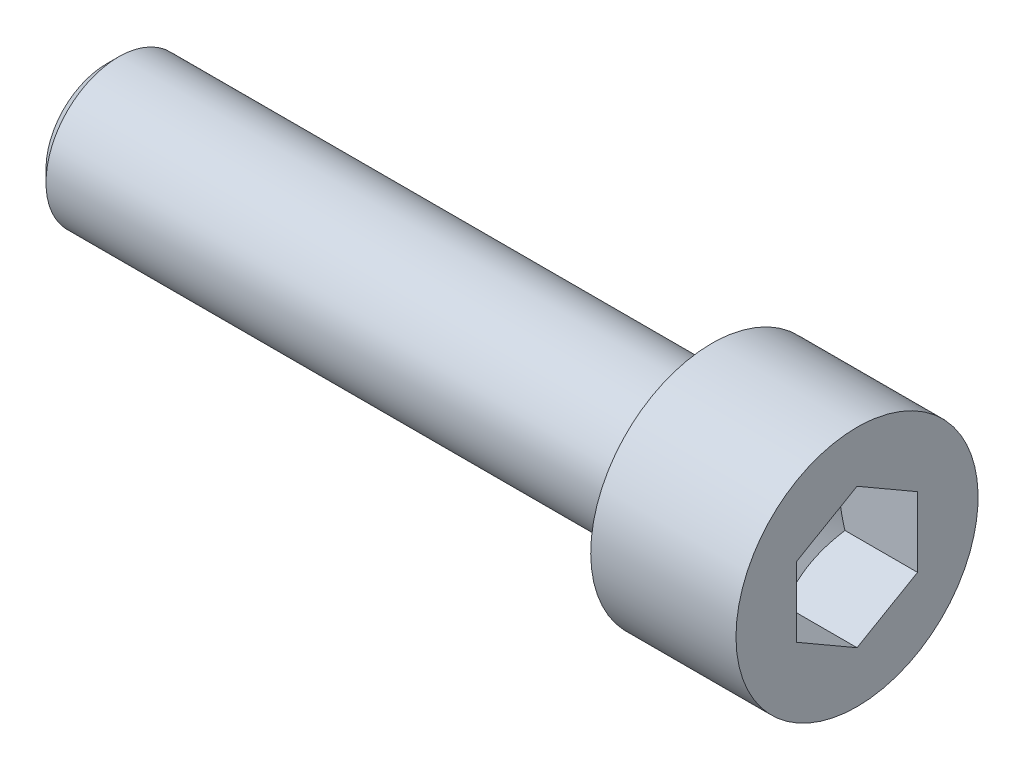
ISO-10303-21;
HEADER;
FILE_DESCRIPTION(('STEP AP214'),'2;1');
FILE_NAME('part.step','',(''),(''),'','','');
FILE_SCHEMA(('AUTOMOTIVE_DESIGN { 1 0 10303 214 1 1 1 1 }'));
ENDSEC;
DATA;
#1=APPLICATION_CONTEXT('core data for automotive mechanical design processes');
#2=APPLICATION_PROTOCOL_DEFINITION('international standard','automotive_design',2000,#1);
#3=PRODUCT_CONTEXT('',#1,'mechanical');
#4=PRODUCT('Part','Part','',(#3));
#5=PRODUCT_RELATED_PRODUCT_CATEGORY('part','',(#4));
#6=PRODUCT_DEFINITION_FORMATION('','',#4);
#7=PRODUCT_DEFINITION_CONTEXT('part definition',#1,'design');
#8=PRODUCT_DEFINITION('design','',#6,#7);
#9=PRODUCT_DEFINITION_SHAPE('','',#8);
#10=(LENGTH_UNIT() NAMED_UNIT(*) SI_UNIT(.MILLI.,.METRE.));
#11=(NAMED_UNIT(*) PLANE_ANGLE_UNIT() SI_UNIT($,.RADIAN.));
#12=(NAMED_UNIT(*) SI_UNIT($,.STERADIAN.) SOLID_ANGLE_UNIT());
#13=UNCERTAINTY_MEASURE_WITH_UNIT(LENGTH_MEASURE(1.E-05),#10,'distance_accuracy_value','');
#14=(GEOMETRIC_REPRESENTATION_CONTEXT(3) GLOBAL_UNCERTAINTY_ASSIGNED_CONTEXT((#13)) GLOBAL_UNIT_ASSIGNED_CONTEXT((#10,
#11,#12)) REPRESENTATION_CONTEXT('',''));
#15=CARTESIAN_POINT('',(0.,0.,0.));
#16=DIRECTION('',(0.,0.,1.));
#17=DIRECTION('',(1.,0.,0.));
#18=AXIS2_PLACEMENT_3D('',#15,#16,#17);
#19=CARTESIAN_POINT('',(0.099999999999972,-5.5,-5.5));
#20=CARTESIAN_POINT('',(0.099999999999972,-5.5,5.5));
#21=CARTESIAN_POINT('',(0.099999999999972,5.5,-5.5));
#22=CARTESIAN_POINT('',(0.099999999999972,5.5,5.5));
#23=(BOUNDED_SURFACE() B_SPLINE_SURFACE(1,1,((#19,#20),(#21,#22)),.UNSPECIFIED.,.F.,.F.,
.F.) B_SPLINE_SURFACE_WITH_KNOTS((2,2),(2,2),(0.,1.),(0.,1.),
.UNSPECIFIED.) GEOMETRIC_REPRESENTATION_ITEM() RATIONAL_B_SPLINE_SURFACE(((1.,1.),(1.,1.))) REPRESENTATION_ITEM('') SURFACE());
#24=CARTESIAN_POINT('',(0.099999999999975,2.88675134594817,0.));
#25=CARTESIAN_POINT('',(0.099999999999975,1.44337567297408,-2.49999999999994));
#26=(BOUNDED_CURVE() B_SPLINE_CURVE(1,(#24,#25),.UNSPECIFIED.,.F.,
.F.) B_SPLINE_CURVE_WITH_KNOTS((2,2),(0.,1.),
.UNSPECIFIED.) CURVE() GEOMETRIC_REPRESENTATION_ITEM() RATIONAL_B_SPLINE_CURVE((1.,1.)) REPRESENTATION_ITEM(''));
#27=CARTESIAN_POINT('',(0.099999999999975,2.88675134594813,1.014813E-13));
#28=VERTEX_POINT('',#27);
#29=CARTESIAN_POINT('',(0.099999999999975,1.44337567297402,-2.49999999999991));
#30=VERTEX_POINT('',#29);
#31=EDGE_CURVE('P0_E202',#28,#30,#26,.T.);
#32=CARTESIAN_POINT('',(0.099999999999975,1.44337567297408,-2.49999999999994));
#33=CARTESIAN_POINT('',(0.099999999999975,-1.44337567297403,-2.49999999999992));
#34=(BOUNDED_CURVE() B_SPLINE_CURVE(1,(#32,#33),.UNSPECIFIED.,.F.,
.F.) B_SPLINE_CURVE_WITH_KNOTS((2,2),(0.,1.),
.UNSPECIFIED.) CURVE() GEOMETRIC_REPRESENTATION_ITEM() RATIONAL_B_SPLINE_CURVE((1.,1.)) REPRESENTATION_ITEM(''));
#35=CARTESIAN_POINT('',(0.099999999999975,-1.44337567297409,-2.49999999999988));
#36=VERTEX_POINT('',#35);
#37=EDGE_CURVE('P0_E116',#30,#36,#34,.T.);
#38=CARTESIAN_POINT('',(0.099999999999975,-1.44337567297403,-2.49999999999992));
#39=CARTESIAN_POINT('',(0.099999999999975,-2.88675134594808,1.246434E-13));
#40=(BOUNDED_CURVE() B_SPLINE_CURVE(1,(#38,#39),.UNSPECIFIED.,.F.,
.F.) B_SPLINE_CURVE_WITH_KNOTS((2,2),(0.,1.),
.UNSPECIFIED.) CURVE() GEOMETRIC_REPRESENTATION_ITEM() RATIONAL_B_SPLINE_CURVE((1.,1.)) REPRESENTATION_ITEM(''));
#41=CARTESIAN_POINT('',(0.099999999999975,-2.88675134594812,1.786765E-13));
#42=VERTEX_POINT('',#41);
#43=EDGE_CURVE('P0_E211',#36,#42,#40,.T.);
#44=CARTESIAN_POINT('',(0.099999999999975,-2.88675134594808,1.246434E-13));
#45=CARTESIAN_POINT('',(0.099999999999975,-1.443375672974,2.50000000000012));
#46=(BOUNDED_CURVE() B_SPLINE_CURVE(1,(#44,#45),.UNSPECIFIED.,.F.,
.F.) B_SPLINE_CURVE_WITH_KNOTS((2,2),(0.,1.),
.UNSPECIFIED.) CURVE() GEOMETRIC_REPRESENTATION_ITEM() RATIONAL_B_SPLINE_CURVE((1.,1.)) REPRESENTATION_ITEM(''));
#47=CARTESIAN_POINT('',(0.099999999999975,-1.44337567297402,2.50000000000016));
#48=VERTEX_POINT('',#47);
#49=EDGE_CURVE('P0_E159',#42,#48,#46,.T.);
#50=CARTESIAN_POINT('',(0.099999999999975,-1.443375672974,2.50000000000012));
#51=CARTESIAN_POINT('',(0.099999999999975,1.44337567297418,2.5));
#52=(BOUNDED_CURVE() B_SPLINE_CURVE(1,(#50,#51),.UNSPECIFIED.,.F.,
.F.) B_SPLINE_CURVE_WITH_KNOTS((2,2),(0.,1.),
.UNSPECIFIED.) CURVE() GEOMETRIC_REPRESENTATION_ITEM() RATIONAL_B_SPLINE_CURVE((1.,1.)) REPRESENTATION_ITEM(''));
#53=CARTESIAN_POINT('',(0.099999999999975,1.44337567297415,2.50000000000005));
#54=VERTEX_POINT('',#53);
#55=EDGE_CURVE('P0_E157',#48,#54,#52,.T.);
#56=CARTESIAN_POINT('',(0.099999999999975,1.44337567297418,2.5));
#57=CARTESIAN_POINT('',(0.099999999999975,2.88675134594817,0.));
#58=(BOUNDED_CURVE() B_SPLINE_CURVE(1,(#56,#57),.UNSPECIFIED.,.F.,
.F.) B_SPLINE_CURVE_WITH_KNOTS((2,2),(0.,1.),
.UNSPECIFIED.) CURVE() GEOMETRIC_REPRESENTATION_ITEM() RATIONAL_B_SPLINE_CURVE((1.,1.)) REPRESENTATION_ITEM(''));
#59=EDGE_CURVE('P0_E145',#54,#28,#58,.T.);
#60=CARTESIAN_POINT('',(0.099999999999972,5.,0.));
#61=CARTESIAN_POINT('',(0.099999999999972,5.,8.66025403784438));
#62=CARTESIAN_POINT('',(0.099999999999972,-2.5,4.33012701892219));
#63=CARTESIAN_POINT('',(0.099999999999972,-10.,0.));
#64=CARTESIAN_POINT('',(0.099999999999972,-2.5,-4.33012701892219));
#65=CARTESIAN_POINT('',(0.099999999999972,5.,-8.66025403784438));
#66=CARTESIAN_POINT('',(0.099999999999972,5.,0.));
#67=(BOUNDED_CURVE() B_SPLINE_CURVE(2,(#60,#61,#62,#63,#64,#65,#66),.UNSPECIFIED.,.T.,
.F.) B_SPLINE_CURVE_WITH_KNOTS((3,2,2,3),(0.,0.333333333333333,0.666666666666667,1.),
.UNSPECIFIED.) CURVE() GEOMETRIC_REPRESENTATION_ITEM() RATIONAL_B_SPLINE_CURVE((1.,0.5,1.,0.5,
1.,0.5,1.)) REPRESENTATION_ITEM(''));
#68=CARTESIAN_POINT('',(0.099999999999972,5.,0.));
#69=VERTEX_POINT('',#68);
#70=EDGE_CURVE('P0_E11',#69,#69,#67,.T.);
#71=ORIENTED_EDGE('',*,*,#31,.T.);
#72=ORIENTED_EDGE('',*,*,#37,.T.);
#73=ORIENTED_EDGE('',*,*,#43,.T.);
#74=ORIENTED_EDGE('',*,*,#49,.T.);
#75=ORIENTED_EDGE('',*,*,#55,.T.);
#76=ORIENTED_EDGE('',*,*,#59,.T.);
#77=EDGE_LOOP('',(#71,#72,#73,#74,#75,#76));
#78=FACE_BOUND('',#77,.T.);
#79=ORIENTED_EDGE('',*,*,#70,.T.);
#80=EDGE_LOOP('',(#79));
#81=FACE_BOUND('',#80,.T.);
#82=ADVANCED_FACE('P0_F17',(#78,#81),#23,.T.);
#83=CARTESIAN_POINT('',(-5.9,5.,0.));
#84=CARTESIAN_POINT('',(0.099999999999972,5.,0.));
#85=CARTESIAN_POINT('',(-5.9,5.,8.66025403784438));
#86=CARTESIAN_POINT('',(0.099999999999972,5.,8.66025403784438));
#87=CARTESIAN_POINT('',(-5.9,-2.5,4.3301270189222));
#88=CARTESIAN_POINT('',(0.099999999999972,-2.5,4.33012701892219));
#89=CARTESIAN_POINT('',(-5.9,-10.,0.));
#90=CARTESIAN_POINT('',(0.099999999999972,-10.,0.));
#91=CARTESIAN_POINT('',(-5.9,-2.5,-4.33012701892219));
#92=CARTESIAN_POINT('',(0.099999999999972,-2.5,-4.33012701892219));
#93=CARTESIAN_POINT('',(-5.9,5.,-8.66025403784438));
#94=CARTESIAN_POINT('',(0.099999999999972,5.,-8.66025403784438));
#95=CARTESIAN_POINT('',(-5.9,5.,0.));
#96=CARTESIAN_POINT('',(0.099999999999972,5.,0.));
#97=(BOUNDED_SURFACE() B_SPLINE_SURFACE(2,1,((#83,#84),(#85,#86),(#87,#88),(#89,#90),(#91,#92),
(#93,#94),(#95,#96)),.UNSPECIFIED.,.T.,.F.,.F.) B_SPLINE_SURFACE_WITH_KNOTS((3,2,2,3),(2,2),(0.,
0.333333333333333,0.666666666666667,1.),(0.,1.),
.UNSPECIFIED.) GEOMETRIC_REPRESENTATION_ITEM() RATIONAL_B_SPLINE_SURFACE(((1.,1.),(0.5,0.5),(1.,
1.),(0.5,0.5),(1.,1.),(0.5,0.5),(1.,1.))) REPRESENTATION_ITEM('') SURFACE());
#98=CARTESIAN_POINT('',(-5.9,5.,0.));
#99=CARTESIAN_POINT('',(-5.9,5.,8.66025403784438));
#100=CARTESIAN_POINT('',(-5.9,-2.5,4.3301270189222));
#101=CARTESIAN_POINT('',(-5.9,-10.,0.));
#102=CARTESIAN_POINT('',(-5.9,-2.5,-4.33012701892219));
#103=CARTESIAN_POINT('',(-5.9,5.,-8.66025403784438));
#104=CARTESIAN_POINT('',(-5.9,5.,0.));
#105=(BOUNDED_CURVE() B_SPLINE_CURVE(2,(#98,#99,#100,#101,#102,#103,#104),.UNSPECIFIED.,.T.,
.F.) B_SPLINE_CURVE_WITH_KNOTS((3,2,2,3),(0.,0.333333333333333,0.666666666666667,1.),
.UNSPECIFIED.) CURVE() GEOMETRIC_REPRESENTATION_ITEM() RATIONAL_B_SPLINE_CURVE((1.,0.5,1.,0.5,
1.,0.5,1.)) REPRESENTATION_ITEM(''));
#106=CARTESIAN_POINT('',(-5.9,5.,0.));
#107=VERTEX_POINT('',#106);
#108=EDGE_CURVE('P0_E22',#107,#107,#105,.T.);
#109=CARTESIAN_POINT('',(0.099999999999972,5.,0.));
#110=CARTESIAN_POINT('',(-5.9,5.,0.));
#111=(BOUNDED_CURVE() B_SPLINE_CURVE(1,(#109,#110),.UNSPECIFIED.,.F.,
.F.) B_SPLINE_CURVE_WITH_KNOTS((2,2),(0.,1.),
.UNSPECIFIED.) CURVE() GEOMETRIC_REPRESENTATION_ITEM() RATIONAL_B_SPLINE_CURVE((1.,1.)) REPRESENTATION_ITEM(''));
#112=EDGE_CURVE('P0_E30',#69,#107,#111,.T.);
#113=ORIENTED_EDGE('',*,*,#108,.T.);
#114=ORIENTED_EDGE('',*,*,#112,.F.);
#115=ORIENTED_EDGE('',*,*,#70,.F.);
#116=ORIENTED_EDGE('',*,*,#112,.T.);
#117=EDGE_LOOP('',(#113,#114,#115,#116));
#118=FACE_BOUND('',#117,.T.);
#119=ADVANCED_FACE('P0_F445',(#118),#97,.T.);
#120=CARTESIAN_POINT('',(-5.9,-5.5,5.5));
#121=CARTESIAN_POINT('',(-5.9,-5.5,-5.5));
#122=CARTESIAN_POINT('',(-5.9,5.5,5.5));
#123=CARTESIAN_POINT('',(-5.9,5.5,-5.5));
#124=(BOUNDED_SURFACE() B_SPLINE_SURFACE(1,1,((#120,#121),(#122,#123)),.UNSPECIFIED.,.F.,.F.,
.F.) B_SPLINE_SURFACE_WITH_KNOTS((2,2),(2,2),(0.,1.),(0.,1.),
.UNSPECIFIED.) GEOMETRIC_REPRESENTATION_ITEM() RATIONAL_B_SPLINE_SURFACE(((1.,1.),(1.,1.))) REPRESENTATION_ITEM('') SURFACE());
#125=CARTESIAN_POINT('',(-5.9,3.00000000001427,0.));
#126=CARTESIAN_POINT('',(-5.9,3.00000000001426,5.19615242273134));
#127=CARTESIAN_POINT('',(-5.9,-1.50000000000713,2.59807621136567));
#128=CARTESIAN_POINT('',(-5.9,-6.00000000002853,0.));
#129=CARTESIAN_POINT('',(-5.9,-1.50000000000713,-2.59807621136567));
#130=CARTESIAN_POINT('',(-5.9,3.00000000001426,-5.19615242273134));
#131=CARTESIAN_POINT('',(-5.9,3.00000000001427,0.));
#132=(BOUNDED_CURVE() B_SPLINE_CURVE(2,(#125,#126,#127,#128,#129,#130,#131),.UNSPECIFIED.,.T.,
.F.) B_SPLINE_CURVE_WITH_KNOTS((3,2,2,3),(0.,0.333333333333333,0.666666666666667,1.),
.UNSPECIFIED.) CURVE() GEOMETRIC_REPRESENTATION_ITEM() RATIONAL_B_SPLINE_CURVE((1.,0.5,1.,0.5,
1.,0.5,1.)) REPRESENTATION_ITEM(''));
#133=CARTESIAN_POINT('',(-5.9,3.00000000001427,0.));
#134=VERTEX_POINT('',#133);
#135=EDGE_CURVE('P0_E248',#134,#134,#132,.T.);
#136=ORIENTED_EDGE('',*,*,#135,.T.);
#137=EDGE_LOOP('',(#136));
#138=FACE_BOUND('',#137,.T.);
#139=ORIENTED_EDGE('',*,*,#108,.F.);
#140=EDGE_LOOP('',(#139));
#141=FACE_BOUND('',#140,.T.);
#142=ADVANCED_FACE('P0_F362',(#138,#141),#124,.T.);
#143=CARTESIAN_POINT('',(-6.9,3.00000000001428,0.));
#144=CARTESIAN_POINT('',(-5.9,3.00000000001427,0.));
#145=CARTESIAN_POINT('',(-6.9,3.00000000001428,5.19615242273136));
#146=CARTESIAN_POINT('',(-5.9,3.00000000001427,5.19615242273134));
#147=CARTESIAN_POINT('',(-6.9,-1.50000000000714,2.59807621136568));
#148=CARTESIAN_POINT('',(-5.9,-1.50000000000713,2.59807621136567));
#149=CARTESIAN_POINT('',(-6.9,-6.00000000002856,0.));
#150=CARTESIAN_POINT('',(-5.9,-6.00000000002853,0.));
#151=CARTESIAN_POINT('',(-6.9,-1.50000000000714,-2.59807621136568));
#152=CARTESIAN_POINT('',(-5.9,-1.50000000000713,-2.59807621136567));
#153=CARTESIAN_POINT('',(-6.9,3.00000000001427,-5.19615242273136));
#154=CARTESIAN_POINT('',(-5.9,3.00000000001426,-5.19615242273134));
#155=CARTESIAN_POINT('',(-6.9,3.00000000001428,0.));
#156=CARTESIAN_POINT('',(-5.9,3.00000000001427,0.));
#157=(BOUNDED_SURFACE() B_SPLINE_SURFACE(2,1,((#143,#144),(#145,#146),(#147,#148),(#149,#150),
(#151,#152),(#153,#154),(#155,#156)),.UNSPECIFIED.,.T.,.F.,.F.) B_SPLINE_SURFACE_WITH_KNOTS((3,
2,2,3),(2,2),(0.,0.333333333333333,0.666666666666667,1.),(0.,1.),
.UNSPECIFIED.) GEOMETRIC_REPRESENTATION_ITEM() RATIONAL_B_SPLINE_SURFACE(((1.,1.),(0.5,0.5),(1.,
1.),(0.5,0.5),(1.,1.),(0.5,0.5),(1.,1.))) REPRESENTATION_ITEM('') SURFACE());
#158=CARTESIAN_POINT('',(-6.9,3.00000000001428,0.));
#159=CARTESIAN_POINT('',(-6.9,3.00000000001428,5.19615242273136));
#160=CARTESIAN_POINT('',(-6.9,-1.50000000000714,2.59807621136568));
#161=CARTESIAN_POINT('',(-6.9,-6.00000000002856,0.));
#162=CARTESIAN_POINT('',(-6.9,-1.50000000000714,-2.59807621136568));
#163=CARTESIAN_POINT('',(-6.9,3.00000000001427,-5.19615242273136));
#164=CARTESIAN_POINT('',(-6.9,3.00000000001428,0.));
#165=(BOUNDED_CURVE() B_SPLINE_CURVE(2,(#158,#159,#160,#161,#162,#163,#164),.UNSPECIFIED.,.T.,
.F.) B_SPLINE_CURVE_WITH_KNOTS((3,2,2,3),(0.,0.333333333333333,0.666666666666667,1.),
.UNSPECIFIED.) CURVE() GEOMETRIC_REPRESENTATION_ITEM() RATIONAL_B_SPLINE_CURVE((1.,0.5,1.,0.5,
1.,0.5,1.)) REPRESENTATION_ITEM(''));
#166=CARTESIAN_POINT('',(-6.9,3.00000000001428,0.));
#167=VERTEX_POINT('',#166);
#168=EDGE_CURVE('P0_E154',#167,#167,#165,.T.);
#169=CARTESIAN_POINT('',(-5.9,3.00000000001427,0.));
#170=CARTESIAN_POINT('',(-6.9,3.00000000001428,0.));
#171=(BOUNDED_CURVE() B_SPLINE_CURVE(1,(#169,#170),.UNSPECIFIED.,.F.,
.F.) B_SPLINE_CURVE_WITH_KNOTS((2,2),(0.,1.),
.UNSPECIFIED.) CURVE() GEOMETRIC_REPRESENTATION_ITEM() RATIONAL_B_SPLINE_CURVE((1.,1.)) REPRESENTATION_ITEM(''));
#172=EDGE_CURVE('P0_E90',#134,#167,#171,.T.);
#173=ORIENTED_EDGE('',*,*,#168,.T.);
#174=ORIENTED_EDGE('',*,*,#172,.F.);
#175=ORIENTED_EDGE('',*,*,#135,.F.);
#176=ORIENTED_EDGE('',*,*,#172,.T.);
#177=EDGE_LOOP('',(#173,#174,#175,#176));
#178=FACE_BOUND('',#177,.T.);
#179=ADVANCED_FACE('P0_F356',(#178),#157,.T.);
#180=CARTESIAN_POINT('',(-6.9,-3.30000000001571,3.30000000001571));
#181=CARTESIAN_POINT('',(-6.9,-3.30000000001571,-3.30000000001571));
#182=CARTESIAN_POINT('',(-6.9,3.30000000001571,3.30000000001571));
#183=CARTESIAN_POINT('',(-6.9,3.30000000001571,-3.30000000001571));
#184=(BOUNDED_SURFACE() B_SPLINE_SURFACE(1,1,((#180,#181),(#182,#183)),.UNSPECIFIED.,.F.,.F.,
.F.) B_SPLINE_SURFACE_WITH_KNOTS((2,2),(2,2),(0.,1.),(0.,1.),
.UNSPECIFIED.) GEOMETRIC_REPRESENTATION_ITEM() RATIONAL_B_SPLINE_SURFACE(((1.,1.),(1.,1.))) REPRESENTATION_ITEM('') SURFACE());
#185=ORIENTED_EDGE('',*,*,#168,.F.);
#186=EDGE_LOOP('',(#185));
#187=FACE_BOUND('',#186,.T.);
#188=ADVANCED_FACE('P0_F361',(#187),#184,.T.);
#189=CARTESIAN_POINT('',(0.099999999999972,1.44337567297415,2.50000000000005));
#190=CARTESIAN_POINT('',(-4.13452505549687,1.44337567297415,2.50000000000005));
#191=CARTESIAN_POINT('',(0.099999999999972,2.88675134594813,1.014813E-13));
#192=CARTESIAN_POINT('',(-4.13452505549687,2.88675134594813,1.014813E-13));
#193=(BOUNDED_SURFACE() B_SPLINE_SURFACE(1,1,((#189,#190),(#191,#192)),.UNSPECIFIED.,.F.,.F.,
.F.) B_SPLINE_SURFACE_WITH_KNOTS((2,2),(2,2),(0.,1.),(0.,0.891381592873045),
.UNSPECIFIED.) GEOMETRIC_REPRESENTATION_ITEM() RATIONAL_B_SPLINE_SURFACE(((1.,1.),(1.,1.))) REPRESENTATION_ITEM('') SURFACE());
#194=CARTESIAN_POINT('',(0.099999999999975,2.88675134594817,0.));
#195=CARTESIAN_POINT('',(-2.9,2.88675134594817,0.));
#196=(BOUNDED_CURVE() B_SPLINE_CURVE(1,(#194,#195),.UNSPECIFIED.,.F.,
.F.) B_SPLINE_CURVE_WITH_KNOTS((2,2),(0.,0.631509967132636),
.UNSPECIFIED.) CURVE() GEOMETRIC_REPRESENTATION_ITEM() RATIONAL_B_SPLINE_CURVE((1.,1.)) REPRESENTATION_ITEM(''));
#197=CARTESIAN_POINT('',(-2.9,2.88675134594817,0.));
#198=VERTEX_POINT('',#197);
#199=EDGE_CURVE('P0_E151',#28,#198,#196,.T.);
#200=CARTESIAN_POINT('',(-2.9,1.44337567297418,2.5));
#201=CARTESIAN_POINT('',(0.099999999999975,1.44337567297418,2.5));
#202=(BOUNDED_CURVE() B_SPLINE_CURVE(1,(#200,#201),.UNSPECIFIED.,.F.,
.F.) B_SPLINE_CURVE_WITH_KNOTS((2,2),(0.368490032867366,1.),
.UNSPECIFIED.) CURVE() GEOMETRIC_REPRESENTATION_ITEM() RATIONAL_B_SPLINE_CURVE((1.,1.)) REPRESENTATION_ITEM(''));
#203=CARTESIAN_POINT('',(-2.9,1.44337567297415,2.50000000000005));
#204=VERTEX_POINT('',#203);
#205=EDGE_CURVE('P0_E149',#204,#54,#202,.T.);
#206=CARTESIAN_POINT('',(-2.9,2.88675134594822,0.));
#207=CARTESIAN_POINT('',(-3.3376297113811,2.16506350946119,1.25000000000003));
#208=CARTESIAN_POINT('',(-2.90000000000003,1.44337567297416,2.50000000000005));
#209=(BOUNDED_CURVE() B_SPLINE_CURVE(2,(#206,#207,#208),.UNSPECIFIED.,.F.,
.F.) B_SPLINE_CURVE_WITH_KNOTS((3,3),(0.,1.),
.UNSPECIFIED.) CURVE() GEOMETRIC_REPRESENTATION_ITEM() RATIONAL_B_SPLINE_CURVE((1.,
1.15470053837925,1.)) REPRESENTATION_ITEM(''));
#210=EDGE_CURVE('P0_E137',#198,#204,#209,.T.);
#211=ORIENTED_EDGE('',*,*,#199,.F.);
#212=ORIENTED_EDGE('',*,*,#59,.F.);
#213=ORIENTED_EDGE('',*,*,#205,.F.);
#214=ORIENTED_EDGE('',*,*,#210,.F.);
#215=EDGE_LOOP('',(#211,#212,#213,#214));
#216=FACE_BOUND('',#215,.T.);
#217=ADVANCED_FACE('P0_F147',(#216),#193,.F.);
#218=CARTESIAN_POINT('',(-4.65051884552429,0.,0.));
#219=CARTESIAN_POINT('',(-2.9,2.88675134594821,0.));
#220=CARTESIAN_POINT('',(-4.65051884552429,0.,0.));
#221=CARTESIAN_POINT('',(-2.90000000000003,2.88675134594824,-5.));
#222=CARTESIAN_POINT('',(-4.65051884552429,0.,0.));
#223=CARTESIAN_POINT('',(-2.9,-1.44337567297402,-2.5));
#224=CARTESIAN_POINT('',(-4.65051884552429,0.,0.));
#225=CARTESIAN_POINT('',(-2.90000000000004,-5.77350269189628,0.));
#226=CARTESIAN_POINT('',(-4.65051884552429,0.,0.));
#227=CARTESIAN_POINT('',(-2.9,-1.44337567297405,2.50000000000005));
#228=CARTESIAN_POINT('',(-4.65051884552429,0.,0.));
#229=CARTESIAN_POINT('',(-2.90000000000003,2.88675134594818,5.00000000000011));
#230=CARTESIAN_POINT('',(-4.65051884552429,0.,0.));
#231=CARTESIAN_POINT('',(-2.9,2.88675134594821,0.));
#232=(BOUNDED_SURFACE() B_SPLINE_SURFACE(2,1,((#218,#219),(#220,#221),(#222,#223),(#224,#225),
(#226,#227),(#228,#229),(#230,#231)),.UNSPECIFIED.,.T.,.F.,.F.) B_SPLINE_SURFACE_WITH_KNOTS((3,
2,2,3),(2,2),(0.,0.333333333333333,0.666666666666667,1.),(0.,1.),
.UNSPECIFIED.) GEOMETRIC_REPRESENTATION_ITEM() RATIONAL_B_SPLINE_SURFACE(((1.,1.),(0.5,0.5),(1.,
1.),(0.5,0.5),(1.,1.),(0.5,0.5),(1.,1.))) REPRESENTATION_ITEM('') SURFACE());
#233=CARTESIAN_POINT('',(-2.9,2.88675134594821,0.));
#234=CARTESIAN_POINT('',(-4.6505188455243,0.,0.));
#235=(BOUNDED_CURVE() B_SPLINE_CURVE(1,(#233,#234),.UNSPECIFIED.,.F.,
.F.) B_SPLINE_CURVE_WITH_KNOTS((2,2),(0.,1.),
.UNSPECIFIED.) CURVE() GEOMETRIC_REPRESENTATION_ITEM() RATIONAL_B_SPLINE_CURVE((1.,1.)) REPRESENTATION_ITEM(''));
#236=CARTESIAN_POINT('',(-4.6505188455243,0.,0.));
#237=VERTEX_POINT('',#236);
#238=EDGE_CURVE('P0_E78',#198,#237,#235,.T.);
#239=CARTESIAN_POINT('',(-2.90000000000003,1.44337567297422,2.5));
#240=CARTESIAN_POINT('',(-3.33762971138109,1.285997E-13,2.50000000000007));
#241=CARTESIAN_POINT('',(-2.90000000000004,-1.44337567297396,2.50000000000012));
#242=(BOUNDED_CURVE() B_SPLINE_CURVE(2,(#239,#240,#241),.UNSPECIFIED.,.F.,
.F.) B_SPLINE_CURVE_WITH_KNOTS((3,3),(0.,1.),
.UNSPECIFIED.) CURVE() GEOMETRIC_REPRESENTATION_ITEM() RATIONAL_B_SPLINE_CURVE((1.,
1.15470053837925,1.)) REPRESENTATION_ITEM(''));
#243=CARTESIAN_POINT('',(-2.9,-1.44337567297402,2.50000000000016));
#244=VERTEX_POINT('',#243);
#245=EDGE_CURVE('P0_E167',#204,#244,#242,.T.);
#246=CARTESIAN_POINT('',(-2.90000000000004,-1.44337567297402,2.50000000000008));
#247=CARTESIAN_POINT('',(-3.33762971138111,-2.16506350946107,1.25000000000006));
#248=CARTESIAN_POINT('',(-2.90000000000004,-2.88675134594812,0.));
#249=(BOUNDED_CURVE() B_SPLINE_CURVE(2,(#246,#247,#248),.UNSPECIFIED.,.F.,
.F.) B_SPLINE_CURVE_WITH_KNOTS((3,3),(0.,1.),
.UNSPECIFIED.) CURVE() GEOMETRIC_REPRESENTATION_ITEM() RATIONAL_B_SPLINE_CURVE((1.,
1.15470053837925,1.)) REPRESENTATION_ITEM(''));
#250=CARTESIAN_POINT('',(-2.9,-2.88675134594812,1.786765E-13));
#251=VERTEX_POINT('',#250);
#252=EDGE_CURVE('P0_E219',#244,#251,#249,.T.);
#253=CARTESIAN_POINT('',(-2.90000000000005,-2.88675134594813,2.061754E-13));
#254=CARTESIAN_POINT('',(-3.33762971138118,-2.16506350946104,-1.24999999999993));
#255=CARTESIAN_POINT('',(-2.90000000000004,-1.44337567297395,-2.50000000000006));
#256=(BOUNDED_CURVE() B_SPLINE_CURVE(2,(#253,#254,#255),.UNSPECIFIED.,.F.,
.F.) B_SPLINE_CURVE_WITH_KNOTS((3,3),(0.,1.),
.UNSPECIFIED.) CURVE() GEOMETRIC_REPRESENTATION_ITEM() RATIONAL_B_SPLINE_CURVE((1.,
1.15470053837928,1.)) REPRESENTATION_ITEM(''));
#257=CARTESIAN_POINT('',(-2.90000000000003,-1.44337567297409,-2.49999999999988));
#258=VERTEX_POINT('',#257);
#259=EDGE_CURVE('P0_E130',#251,#258,#256,.T.);
#260=CARTESIAN_POINT('',(-2.90000000000004,-1.44337567297419,-2.49999999999992));
#261=CARTESIAN_POINT('',(-3.33762971138118,0.,-2.49999999999993));
#262=CARTESIAN_POINT('',(-2.90000000000003,1.44337567297425,-2.49999999999994));
#263=(BOUNDED_CURVE() B_SPLINE_CURVE(2,(#260,#261,#262),.UNSPECIFIED.,.F.,
.F.) B_SPLINE_CURVE_WITH_KNOTS((3,3),(0.,1.),
.UNSPECIFIED.) CURVE() GEOMETRIC_REPRESENTATION_ITEM() RATIONAL_B_SPLINE_CURVE((1.,
1.15470053837929,1.)) REPRESENTATION_ITEM(''));
#264=CARTESIAN_POINT('',(-2.90000000000003,1.44337567297402,-2.49999999999991));
#265=VERTEX_POINT('',#264);
#266=EDGE_CURVE('P0_E270',#258,#265,#263,.T.);
#267=CARTESIAN_POINT('',(-2.9,1.44337567297399,-2.50000000000009));
#268=CARTESIAN_POINT('',(-3.33762971138117,2.16506350946111,-1.24999999999997));
#269=CARTESIAN_POINT('',(-2.9,2.88675134594822,1.593379E-13));
#270=(BOUNDED_CURVE() B_SPLINE_CURVE(2,(#267,#268,#269),.UNSPECIFIED.,.F.,
.F.) B_SPLINE_CURVE_WITH_KNOTS((3,3),(0.,1.),
.UNSPECIFIED.) CURVE() GEOMETRIC_REPRESENTATION_ITEM() RATIONAL_B_SPLINE_CURVE((1.,
1.15470053837928,1.)) REPRESENTATION_ITEM(''));
#271=EDGE_CURVE('P0_E201',#265,#198,#270,.T.);
#272=ORIENTED_EDGE('',*,*,#238,.T.);
#273=ORIENTED_EDGE('',*,*,#238,.F.);
#274=ORIENTED_EDGE('',*,*,#210,.T.);
#275=ORIENTED_EDGE('',*,*,#245,.T.);
#276=ORIENTED_EDGE('',*,*,#252,.T.);
#277=ORIENTED_EDGE('',*,*,#259,.T.);
#278=ORIENTED_EDGE('',*,*,#266,.T.);
#279=ORIENTED_EDGE('',*,*,#271,.T.);
#280=EDGE_LOOP('',(#272,#273,#274,#275,#276,#277,#278,#279));
#281=FACE_BOUND('',#280,.T.);
#282=ADVANCED_FACE('P0_F410',(#281),#232,.T.);
#283=CARTESIAN_POINT('',(0.099999999999972,2.88675134594813,1.014813E-13));
#284=CARTESIAN_POINT('',(-4.13452505549692,2.88675134594813,1.014813E-13));
#285=CARTESIAN_POINT('',(0.099999999999972,1.44337567297402,-2.49999999999991));
#286=CARTESIAN_POINT('',(-4.13452505549692,1.44337567297402,-2.49999999999991));
#287=(BOUNDED_SURFACE() B_SPLINE_SURFACE(1,1,((#283,#284),(#285,#286)),.UNSPECIFIED.,.F.,.F.,
.F.) B_SPLINE_SURFACE_WITH_KNOTS((2,2),(2,2),(0.,1.),(0.,0.891381592873054),
.UNSPECIFIED.) GEOMETRIC_REPRESENTATION_ITEM() RATIONAL_B_SPLINE_SURFACE(((1.,1.),(1.,1.))) REPRESENTATION_ITEM('') SURFACE());
#288=CARTESIAN_POINT('',(-2.90000000000003,1.44337567297408,-2.49999999999994));
#289=CARTESIAN_POINT('',(0.099999999999975,1.44337567297408,-2.49999999999994));
#290=(BOUNDED_CURVE() B_SPLINE_CURVE(1,(#288,#289),.UNSPECIFIED.,.F.,
.F.) B_SPLINE_CURVE_WITH_KNOTS((2,2),(0.368490032867363,1.),
.UNSPECIFIED.) CURVE() GEOMETRIC_REPRESENTATION_ITEM() RATIONAL_B_SPLINE_CURVE((1.,1.)) REPRESENTATION_ITEM(''));
#291=EDGE_CURVE('P0_E233',#265,#30,#290,.T.);
#292=ORIENTED_EDGE('',*,*,#291,.T.);
#293=ORIENTED_EDGE('',*,*,#31,.F.);
#294=ORIENTED_EDGE('',*,*,#199,.T.);
#295=ORIENTED_EDGE('',*,*,#271,.F.);
#296=EDGE_LOOP('',(#292,#293,#294,#295));
#297=FACE_BOUND('',#296,.T.);
#298=ADVANCED_FACE('P0_F400',(#297),#287,.F.);
#299=CARTESIAN_POINT('',(0.099999999999972,1.44337567297402,-2.49999999999991));
#300=CARTESIAN_POINT('',(-4.13452505549692,1.44337567297402,-2.49999999999991));
#301=CARTESIAN_POINT('',(0.099999999999972,-1.44337567297409,-2.49999999999988));
#302=CARTESIAN_POINT('',(-4.13452505549692,-1.44337567297409,-2.49999999999988));
#303=(BOUNDED_SURFACE() B_SPLINE_SURFACE(1,1,((#299,#300),(#301,#302)),.UNSPECIFIED.,.F.,.F.,
.F.) B_SPLINE_SURFACE_WITH_KNOTS((2,2),(2,2),(0.,1.),(0.,0.891381592873056),
.UNSPECIFIED.) GEOMETRIC_REPRESENTATION_ITEM() RATIONAL_B_SPLINE_SURFACE(((1.,1.),(1.,1.))) REPRESENTATION_ITEM('') SURFACE());
#304=CARTESIAN_POINT('',(-2.90000000000003,-1.44337567297403,-2.49999999999992));
#305=CARTESIAN_POINT('',(0.099999999999975,-1.44337567297403,-2.49999999999992));
#306=(BOUNDED_CURVE() B_SPLINE_CURVE(1,(#304,#305),.UNSPECIFIED.,.F.,
.F.) B_SPLINE_CURVE_WITH_KNOTS((2,2),(0.368490032867363,1.),
.UNSPECIFIED.) CURVE() GEOMETRIC_REPRESENTATION_ITEM() RATIONAL_B_SPLINE_CURVE((1.,1.)) REPRESENTATION_ITEM(''));
#307=EDGE_CURVE('P0_E218',#258,#36,#306,.T.);
#308=ORIENTED_EDGE('',*,*,#307,.T.);
#309=ORIENTED_EDGE('',*,*,#37,.F.);
#310=ORIENTED_EDGE('',*,*,#291,.F.);
#311=ORIENTED_EDGE('',*,*,#266,.F.);
#312=EDGE_LOOP('',(#308,#309,#310,#311));
#313=FACE_BOUND('',#312,.T.);
#314=ADVANCED_FACE('P0_F391',(#313),#303,.F.);
#315=CARTESIAN_POINT('',(0.099999999999972,-1.44337567297409,-2.49999999999988));
#316=CARTESIAN_POINT('',(-4.13452505549693,-1.44337567297409,-2.49999999999988));
#317=CARTESIAN_POINT('',(0.099999999999972,-2.88675134594812,1.786765E-13));
#318=CARTESIAN_POINT('',(-4.13452505549693,-2.88675134594812,1.786765E-13));
#319=(BOUNDED_SURFACE() B_SPLINE_SURFACE(1,1,((#315,#316),(#317,#318)),.UNSPECIFIED.,.F.,.F.,
.F.) B_SPLINE_SURFACE_WITH_KNOTS((2,2),(2,2),(0.,1.),(0.,0.891381592873056),
.UNSPECIFIED.) GEOMETRIC_REPRESENTATION_ITEM() RATIONAL_B_SPLINE_SURFACE(((1.,1.),(1.,1.))) REPRESENTATION_ITEM('') SURFACE());
#320=CARTESIAN_POINT('',(-2.9,-2.88675134594808,0.));
#321=CARTESIAN_POINT('',(0.099999999999975,-2.88675134594808,0.));
#322=(BOUNDED_CURVE() B_SPLINE_CURVE(1,(#320,#321),.UNSPECIFIED.,.F.,
.F.) B_SPLINE_CURVE_WITH_KNOTS((2,2),(0.368490032867364,1.),
.UNSPECIFIED.) CURVE() GEOMETRIC_REPRESENTATION_ITEM() RATIONAL_B_SPLINE_CURVE((1.,1.)) REPRESENTATION_ITEM(''));
#323=EDGE_CURVE('P0_E210',#251,#42,#322,.T.);
#324=ORIENTED_EDGE('',*,*,#323,.T.);
#325=ORIENTED_EDGE('',*,*,#43,.F.);
#326=ORIENTED_EDGE('',*,*,#307,.F.);
#327=ORIENTED_EDGE('',*,*,#259,.F.);
#328=EDGE_LOOP('',(#324,#325,#326,#327));
#329=FACE_BOUND('',#328,.T.);
#330=ADVANCED_FACE('P0_F381',(#329),#319,.F.);
#331=CARTESIAN_POINT('',(0.099999999999972,-2.88675134594812,1.786765E-13));
#332=CARTESIAN_POINT('',(-4.13452505549689,-2.88675134594812,1.786765E-13));
#333=CARTESIAN_POINT('',(0.099999999999972,-1.44337567297402,2.50000000000016));
#334=CARTESIAN_POINT('',(-4.13452505549689,-1.44337567297402,2.50000000000016));
#335=(BOUNDED_SURFACE() B_SPLINE_SURFACE(1,1,((#331,#332),(#333,#334)),.UNSPECIFIED.,.F.,.F.,
.F.) B_SPLINE_SURFACE_WITH_KNOTS((2,2),(2,2),(0.,1.),(0.,0.891381592873048),
.UNSPECIFIED.) GEOMETRIC_REPRESENTATION_ITEM() RATIONAL_B_SPLINE_SURFACE(((1.,1.),(1.,1.))) REPRESENTATION_ITEM('') SURFACE());
#336=CARTESIAN_POINT('',(-2.9,-1.443375672974,2.50000000000012));
#337=CARTESIAN_POINT('',(0.099999999999975,-1.443375672974,2.50000000000012));
#338=(BOUNDED_CURVE() B_SPLINE_CURVE(1,(#336,#337),.UNSPECIFIED.,.F.,
.F.) B_SPLINE_CURVE_WITH_KNOTS((2,2),(0.368490032867366,1.),
.UNSPECIFIED.) CURVE() GEOMETRIC_REPRESENTATION_ITEM() RATIONAL_B_SPLINE_CURVE((1.,1.)) REPRESENTATION_ITEM(''));
#339=EDGE_CURVE('P0_E164',#244,#48,#338,.T.);
#340=ORIENTED_EDGE('',*,*,#339,.T.);
#341=ORIENTED_EDGE('',*,*,#49,.F.);
#342=ORIENTED_EDGE('',*,*,#323,.F.);
#343=ORIENTED_EDGE('',*,*,#252,.F.);
#344=EDGE_LOOP('',(#340,#341,#342,#343));
#345=FACE_BOUND('',#344,.T.);
#346=ADVANCED_FACE('P0_F372',(#345),#335,.F.);
#347=CARTESIAN_POINT('',(0.099999999999972,-1.44337567297402,2.50000000000016));
#348=CARTESIAN_POINT('',(-4.13452505549688,-1.44337567297402,2.50000000000016));
#349=CARTESIAN_POINT('',(0.099999999999972,1.44337567297415,2.50000000000005));
#350=CARTESIAN_POINT('',(-4.13452505549688,1.44337567297415,2.50000000000005));
#351=(BOUNDED_SURFACE() B_SPLINE_SURFACE(1,1,((#347,#348),(#349,#350)),.UNSPECIFIED.,.F.,.F.,
.F.) B_SPLINE_SURFACE_WITH_KNOTS((2,2),(2,2),(0.,1.),(0.,0.891381592873046),
.UNSPECIFIED.) GEOMETRIC_REPRESENTATION_ITEM() RATIONAL_B_SPLINE_SURFACE(((1.,1.),(1.,1.))) REPRESENTATION_ITEM('') SURFACE());
#352=ORIENTED_EDGE('',*,*,#205,.T.);
#353=ORIENTED_EDGE('',*,*,#55,.F.);
#354=ORIENTED_EDGE('',*,*,#339,.F.);
#355=ORIENTED_EDGE('',*,*,#245,.F.);
#356=EDGE_LOOP('',(#352,#353,#354,#355));
#357=FACE_BOUND('',#356,.T.);
#358=ADVANCED_FACE('P0_F166',(#357),#351,.F.);
#359=CLOSED_SHELL('',(#82,#119,#142,#179,#188,#217,#282,#298,#314,#330,#346,#358));
#360=MANIFOLD_SOLID_BREP('P0_B1',#359);
#361=CARTESIAN_POINT('',(-6.92,-2.728,-2.728));
#362=CARTESIAN_POINT('',(-6.92,-2.728,2.728));
#363=CARTESIAN_POINT('',(-6.92,2.728,-2.728));
#364=CARTESIAN_POINT('',(-6.92,2.728,2.728));
#365=(BOUNDED_SURFACE() B_SPLINE_SURFACE(1,1,((#361,#362),(#363,#364)),.UNSPECIFIED.,.F.,.F.,
.F.) B_SPLINE_SURFACE_WITH_KNOTS((2,2),(2,2),(0.,1.),(0.,1.),
.UNSPECIFIED.) GEOMETRIC_REPRESENTATION_ITEM() RATIONAL_B_SPLINE_SURFACE(((1.,1.),(1.,1.))) REPRESENTATION_ITEM('') SURFACE());
#366=CARTESIAN_POINT('',(-6.92,2.48,0.));
#367=CARTESIAN_POINT('',(-6.92,2.48,4.2954860027708));
#368=CARTESIAN_POINT('',(-6.92,-1.24,2.1477430013854));
#369=CARTESIAN_POINT('',(-6.92,-4.96,0.));
#370=CARTESIAN_POINT('',(-6.92,-1.24,-2.1477430013854));
#371=CARTESIAN_POINT('',(-6.92,2.48,-4.29548600277081));
#372=CARTESIAN_POINT('',(-6.92,2.48,0.));
#373=(BOUNDED_CURVE() B_SPLINE_CURVE(2,(#366,#367,#368,#369,#370,#371,#372),.UNSPECIFIED.,.T.,
.F.) B_SPLINE_CURVE_WITH_KNOTS((3,2,2,3),(0.,0.333333333333333,0.666666666666667,1.),
.UNSPECIFIED.) CURVE() GEOMETRIC_REPRESENTATION_ITEM() RATIONAL_B_SPLINE_CURVE((1.,0.5,1.,0.5,
1.,0.5,1.)) REPRESENTATION_ITEM(''));
#374=CARTESIAN_POINT('',(-6.92,2.48,0.));
#375=VERTEX_POINT('',#374);
#376=EDGE_CURVE('P1_E11',#375,#375,#373,.T.);
#377=ORIENTED_EDGE('',*,*,#376,.T.);
#378=EDGE_LOOP('',(#377));
#379=FACE_BOUND('',#378,.T.);
#380=ADVANCED_FACE('P1_F17',(#379),#365,.T.);
#381=CARTESIAN_POINT('',(-30.9,2.48,0.));
#382=CARTESIAN_POINT('',(-6.92,2.48,0.));
#383=CARTESIAN_POINT('',(-30.9,2.48,4.29548600277083));
#384=CARTESIAN_POINT('',(-6.92,2.48,4.2954860027708));
#385=CARTESIAN_POINT('',(-30.9,-1.24,2.14774300138542));
#386=CARTESIAN_POINT('',(-6.92,-1.24,2.1477430013854));
#387=CARTESIAN_POINT('',(-30.9,-4.96,0.));
#388=CARTESIAN_POINT('',(-6.92,-4.96,0.));
#389=CARTESIAN_POINT('',(-30.9,-1.24,-2.14774300138542));
#390=CARTESIAN_POINT('',(-6.92,-1.24,-2.1477430013854));
#391=CARTESIAN_POINT('',(-30.9,2.48,-4.29548600277083));
#392=CARTESIAN_POINT('',(-6.92,2.48,-4.29548600277081));
#393=CARTESIAN_POINT('',(-30.9,2.48,0.));
#394=CARTESIAN_POINT('',(-6.92,2.48,0.));
#395=(BOUNDED_SURFACE() B_SPLINE_SURFACE(2,1,((#381,#382),(#383,#384),(#385,#386),(#387,#388),
(#389,#390),(#391,#392),(#393,#394)),.UNSPECIFIED.,.T.,.F.,.F.) B_SPLINE_SURFACE_WITH_KNOTS((3,
2,2,3),(2,2),(0.,0.333333333333333,0.666666666666667,1.),(0.,1.),
.UNSPECIFIED.) GEOMETRIC_REPRESENTATION_ITEM() RATIONAL_B_SPLINE_SURFACE(((1.,1.),(0.5,0.5),(1.,
1.),(0.5,0.5),(1.,1.),(0.5,0.5),(1.,1.))) REPRESENTATION_ITEM('') SURFACE());
#396=CARTESIAN_POINT('',(-30.9,2.48,0.));
#397=CARTESIAN_POINT('',(-30.9,2.48,-4.29548600277083));
#398=CARTESIAN_POINT('',(-30.9,-1.24,-2.14774300138542));
#399=CARTESIAN_POINT('',(-30.9,-4.96,0.));
#400=CARTESIAN_POINT('',(-30.9,-1.24,2.14774300138542));
#401=CARTESIAN_POINT('',(-30.9,2.48,4.29548600277083));
#402=CARTESIAN_POINT('',(-30.9,2.48,0.));
#403=(BOUNDED_CURVE() B_SPLINE_CURVE(2,(#396,#397,#398,#399,#400,#401,#402),.UNSPECIFIED.,.T.,
.F.) B_SPLINE_CURVE_WITH_KNOTS((3,2,2,3),(0.,0.333333333333333,0.666666666666667,1.),
.UNSPECIFIED.) CURVE() GEOMETRIC_REPRESENTATION_ITEM() RATIONAL_B_SPLINE_CURVE((1.,0.5,1.,0.5,
1.,0.5,1.)) REPRESENTATION_ITEM(''));
#404=CARTESIAN_POINT('',(-30.9,2.48,0.));
#405=VERTEX_POINT('',#404);
#406=EDGE_CURVE('P1_E48',#405,#405,#403,.T.);
#407=CARTESIAN_POINT('',(-6.92,2.48,0.));
#408=CARTESIAN_POINT('',(-30.9,2.48,0.));
#409=(BOUNDED_CURVE() B_SPLINE_CURVE(1,(#407,#408),.UNSPECIFIED.,.F.,
.F.) B_SPLINE_CURVE_WITH_KNOTS((2,2),(0.,1.),
.UNSPECIFIED.) CURVE() GEOMETRIC_REPRESENTATION_ITEM() RATIONAL_B_SPLINE_CURVE((1.,1.)) REPRESENTATION_ITEM(''));
#410=EDGE_CURVE('P1_E29',#375,#405,#409,.T.);
#411=ORIENTED_EDGE('',*,*,#406,.F.);
#412=ORIENTED_EDGE('',*,*,#410,.F.);
#413=ORIENTED_EDGE('',*,*,#376,.F.);
#414=ORIENTED_EDGE('',*,*,#410,.T.);
#415=EDGE_LOOP('',(#411,#412,#413,#414));
#416=FACE_BOUND('',#415,.T.);
#417=ADVANCED_FACE('P1_F47',(#416),#395,.T.);
#418=CARTESIAN_POINT('',(-30.9,-2.728,2.728));
#419=CARTESIAN_POINT('',(-30.9,-2.728,-2.728));
#420=CARTESIAN_POINT('',(-30.9,2.728,2.728));
#421=CARTESIAN_POINT('',(-30.9,2.728,-2.728));
#422=(BOUNDED_SURFACE() B_SPLINE_SURFACE(1,1,((#418,#419),(#420,#421)),.UNSPECIFIED.,.F.,.F.,
.F.) B_SPLINE_SURFACE_WITH_KNOTS((2,2),(2,2),(0.,1.),(0.,1.),
.UNSPECIFIED.) GEOMETRIC_REPRESENTATION_ITEM() RATIONAL_B_SPLINE_SURFACE(((1.,1.),(1.,1.))) REPRESENTATION_ITEM('') SURFACE());
#423=ORIENTED_EDGE('',*,*,#406,.T.);
#424=EDGE_LOOP('',(#423));
#425=FACE_BOUND('',#424,.T.);
#426=ADVANCED_FACE('P1_F51',(#425),#422,.T.);
#427=CLOSED_SHELL('',(#380,#417,#426));
#428=MANIFOLD_SOLID_BREP('P1_B1',#427);
#429=CARTESIAN_POINT('',(-30.3999999999857,3.00000000001432,0.));
#430=CARTESIAN_POINT('',(-6.92,3.00000000001428,0.));
#431=CARTESIAN_POINT('',(-30.3999999999858,3.00000000001433,5.19615242273144));
#432=CARTESIAN_POINT('',(-6.92,3.00000000001428,5.19615242273136));
#433=CARTESIAN_POINT('',(-30.3999999999857,-1.50000000000716,2.59807621136572));
#434=CARTESIAN_POINT('',(-6.92,-1.50000000000714,2.59807621136568));
#435=CARTESIAN_POINT('',(-30.3999999999858,-6.00000000002865,0.));
#436=CARTESIAN_POINT('',(-6.92,-6.00000000002856,0.));
#437=CARTESIAN_POINT('',(-30.3999999999857,-1.50000000000717,-2.59807621136572));
#438=CARTESIAN_POINT('',(-6.92,-1.50000000000714,-2.59807621136568));
#439=CARTESIAN_POINT('',(-30.3999999999858,3.00000000001432,-5.19615242273144));
#440=CARTESIAN_POINT('',(-6.92,3.00000000001427,-5.19615242273136));
#441=CARTESIAN_POINT('',(-30.3999999999857,3.00000000001432,0.));
#442=CARTESIAN_POINT('',(-6.92,3.00000000001428,0.));
#443=(BOUNDED_SURFACE() B_SPLINE_SURFACE(2,1,((#429,#430),(#431,#432),(#433,#434),(#435,#436),
(#437,#438),(#439,#440),(#441,#442)),.UNSPECIFIED.,.T.,.F.,.F.) B_SPLINE_SURFACE_WITH_KNOTS((3,
2,2,3),(2,2),(0.,0.333333333333333,0.666666666666667,1.),(0.,1.),
.UNSPECIFIED.) GEOMETRIC_REPRESENTATION_ITEM() RATIONAL_B_SPLINE_SURFACE(((1.,1.),(0.5,0.5),(1.,
1.),(0.5,0.5),(1.,1.),(0.5,0.5),(1.,1.))) REPRESENTATION_ITEM('') SURFACE());
#444=CARTESIAN_POINT('',(-30.3999999999857,3.00000000001432,0.));
#445=CARTESIAN_POINT('',(-30.3999999999858,3.00000000001432,-5.19615242273144));
#446=CARTESIAN_POINT('',(-30.3999999999857,-1.50000000000717,-2.59807621136572));
#447=CARTESIAN_POINT('',(-30.3999999999858,-6.00000000002865,0.));
#448=CARTESIAN_POINT('',(-30.3999999999857,-1.50000000000716,2.59807621136572));
#449=CARTESIAN_POINT('',(-30.3999999999858,3.00000000001433,5.19615242273144));
#450=CARTESIAN_POINT('',(-30.3999999999857,3.00000000001432,0.));
#451=(BOUNDED_CURVE() B_SPLINE_CURVE(2,(#444,#445,#446,#447,#448,#449,#450),.UNSPECIFIED.,.T.,
.F.) B_SPLINE_CURVE_WITH_KNOTS((3,2,2,3),(0.,0.333333333333333,0.666666666666667,1.),
.UNSPECIFIED.) CURVE() GEOMETRIC_REPRESENTATION_ITEM() RATIONAL_B_SPLINE_CURVE((1.,0.5,1.,0.5,
1.,0.5,1.)) REPRESENTATION_ITEM(''));
#452=CARTESIAN_POINT('',(-30.3999999999857,3.00000000001432,0.));
#453=VERTEX_POINT('',#452);
#454=EDGE_CURVE('P2_E22',#453,#453,#451,.T.);
#455=CARTESIAN_POINT('',(-6.92,3.00000000001428,0.));
#456=CARTESIAN_POINT('',(-30.3999999999857,3.00000000001432,0.));
#457=(BOUNDED_CURVE() B_SPLINE_CURVE(1,(#455,#456),.UNSPECIFIED.,.F.,
.F.) B_SPLINE_CURVE_WITH_KNOTS((2,2),(0.,1.),
.UNSPECIFIED.) CURVE() GEOMETRIC_REPRESENTATION_ITEM() RATIONAL_B_SPLINE_CURVE((1.,1.)) REPRESENTATION_ITEM(''));
#458=CARTESIAN_POINT('',(-6.92,3.00000000001428,0.));
#459=VERTEX_POINT('',#458);
#460=EDGE_CURVE('P2_E11',#459,#453,#457,.T.);
#461=CARTESIAN_POINT('',(-6.92,3.00000000001428,0.));
#462=CARTESIAN_POINT('',(-6.92,3.00000000001428,5.19615242273136));
#463=CARTESIAN_POINT('',(-6.92,-1.50000000000714,2.59807621136568));
#464=CARTESIAN_POINT('',(-6.92,-6.00000000002856,0.));
#465=CARTESIAN_POINT('',(-6.92,-1.50000000000714,-2.59807621136568));
#466=CARTESIAN_POINT('',(-6.92,3.00000000001427,-5.19615242273136));
#467=CARTESIAN_POINT('',(-6.92,3.00000000001428,0.));
#468=(BOUNDED_CURVE() B_SPLINE_CURVE(2,(#461,#462,#463,#464,#465,#466,#467),.UNSPECIFIED.,.T.,
.F.) B_SPLINE_CURVE_WITH_KNOTS((3,2,2,3),(0.,0.333333333333333,0.666666666666667,1.),
.UNSPECIFIED.) CURVE() GEOMETRIC_REPRESENTATION_ITEM() RATIONAL_B_SPLINE_CURVE((1.,0.5,1.,0.5,
1.,0.5,1.)) REPRESENTATION_ITEM(''));
#469=EDGE_CURVE('P2_E61',#459,#459,#468,.T.);
#470=ORIENTED_EDGE('',*,*,#454,.F.);
#471=ORIENTED_EDGE('',*,*,#460,.F.);
#472=ORIENTED_EDGE('',*,*,#469,.F.);
#473=ORIENTED_EDGE('',*,*,#460,.T.);
#474=EDGE_LOOP('',(#470,#471,#472,#473));
#475=FACE_BOUND('',#474,.T.);
#476=ADVANCED_FACE('P2_F17',(#475),#443,.T.);
#477=CARTESIAN_POINT('',(-30.9,2.5,0.));
#478=CARTESIAN_POINT('',(-30.3999999999857,3.00000000001432,0.));
#479=CARTESIAN_POINT('',(-30.9,2.5,4.33012701892219));
#480=CARTESIAN_POINT('',(-30.3999999999858,3.00000000001433,5.19615242273144));
#481=CARTESIAN_POINT('',(-30.9,-1.25,2.1650635094611));
#482=CARTESIAN_POINT('',(-30.3999999999857,-1.50000000000716,2.59807621136572));
#483=CARTESIAN_POINT('',(-30.9,-5.,0.));
#484=CARTESIAN_POINT('',(-30.3999999999858,-6.00000000002865,0.));
#485=CARTESIAN_POINT('',(-30.9,-1.25,-2.1650635094611));
#486=CARTESIAN_POINT('',(-30.3999999999857,-1.50000000000717,-2.59807621136572));
#487=CARTESIAN_POINT('',(-30.9,2.5,-4.3301270189222));
#488=CARTESIAN_POINT('',(-30.3999999999858,3.00000000001432,-5.19615242273144));
#489=CARTESIAN_POINT('',(-30.9,2.5,0.));
#490=CARTESIAN_POINT('',(-30.3999999999857,3.00000000001432,0.));
#491=(BOUNDED_SURFACE() B_SPLINE_SURFACE(2,1,((#477,#478),(#479,#480),(#481,#482),(#483,#484),
(#485,#486),(#487,#488),(#489,#490)),.UNSPECIFIED.,.T.,.F.,.F.) B_SPLINE_SURFACE_WITH_KNOTS((3,
2,2,3),(2,2),(0.,0.333333333333333,0.666666666666667,1.),(0.,1.),
.UNSPECIFIED.) GEOMETRIC_REPRESENTATION_ITEM() RATIONAL_B_SPLINE_SURFACE(((1.,1.),(0.5,0.5),(1.,
1.),(0.5,0.5),(1.,1.),(0.5,0.5),(1.,1.))) REPRESENTATION_ITEM('') SURFACE());
#492=CARTESIAN_POINT('',(-30.9,2.5,0.));
#493=CARTESIAN_POINT('',(-30.9,2.5,4.33012701892219));
#494=CARTESIAN_POINT('',(-30.9,-1.25,2.1650635094611));
#495=CARTESIAN_POINT('',(-30.9,-5.,0.));
#496=CARTESIAN_POINT('',(-30.9,-1.25,-2.1650635094611));
#497=CARTESIAN_POINT('',(-30.9,2.5,-4.3301270189222));
#498=CARTESIAN_POINT('',(-30.9,2.5,0.));
#499=(BOUNDED_CURVE() B_SPLINE_CURVE(2,(#492,#493,#494,#495,#496,#497,#498),.UNSPECIFIED.,.T.,
.F.) B_SPLINE_CURVE_WITH_KNOTS((3,2,2,3),(0.,0.333333333333333,0.666666666666667,1.),
.UNSPECIFIED.) CURVE() GEOMETRIC_REPRESENTATION_ITEM() RATIONAL_B_SPLINE_CURVE((1.,0.5,1.,0.5,
1.,0.5,1.)) REPRESENTATION_ITEM(''));
#500=CARTESIAN_POINT('',(-30.9,2.5,0.));
#501=VERTEX_POINT('',#500);
#502=EDGE_CURVE('P2_E93',#501,#501,#499,.T.);
#503=CARTESIAN_POINT('',(-30.3999999999857,3.00000000001432,0.));
#504=CARTESIAN_POINT('',(-30.9,2.5,0.));
#505=(BOUNDED_CURVE() B_SPLINE_CURVE(1,(#503,#504),.UNSPECIFIED.,.F.,
.F.) B_SPLINE_CURVE_WITH_KNOTS((2,2),(0.,1.),
.UNSPECIFIED.) CURVE() GEOMETRIC_REPRESENTATION_ITEM() RATIONAL_B_SPLINE_CURVE((1.,1.)) REPRESENTATION_ITEM(''));
#506=EDGE_CURVE('P2_E51',#453,#501,#505,.T.);
#507=ORIENTED_EDGE('',*,*,#502,.T.);
#508=ORIENTED_EDGE('',*,*,#506,.F.);
#509=ORIENTED_EDGE('',*,*,#454,.T.);
#510=ORIENTED_EDGE('',*,*,#506,.T.);
#511=EDGE_LOOP('',(#507,#508,#509,#510));
#512=FACE_BOUND('',#511,.T.);
#513=ADVANCED_FACE('P2_F113',(#512),#491,.T.);
#514=CARTESIAN_POINT('',(-6.92,2.5,0.));
#515=CARTESIAN_POINT('',(-30.9,2.5,0.));
#516=CARTESIAN_POINT('',(-6.92,2.5,4.33012701892221));
#517=CARTESIAN_POINT('',(-30.9,2.5,4.33012701892219));
#518=CARTESIAN_POINT('',(-6.92,-1.25,2.1650635094611));
#519=CARTESIAN_POINT('',(-30.9,-1.25,2.1650635094611));
#520=CARTESIAN_POINT('',(-6.92,-5.,0.));
#521=CARTESIAN_POINT('',(-30.9,-5.,0.));
#522=CARTESIAN_POINT('',(-6.92,-1.25,-2.1650635094611));
#523=CARTESIAN_POINT('',(-30.9,-1.25,-2.1650635094611));
#524=CARTESIAN_POINT('',(-6.92,2.5,-4.33012701892221));
#525=CARTESIAN_POINT('',(-30.9,2.5,-4.3301270189222));
#526=CARTESIAN_POINT('',(-6.92,2.5,0.));
#527=CARTESIAN_POINT('',(-30.9,2.5,0.));
#528=(BOUNDED_SURFACE() B_SPLINE_SURFACE(2,1,((#514,#515),(#516,#517),(#518,#519),(#520,#521),
(#522,#523),(#524,#525),(#526,#527)),.UNSPECIFIED.,.T.,.F.,.F.) B_SPLINE_SURFACE_WITH_KNOTS((3,
2,2,3),(2,2),(0.,0.333333333333333,0.666666666666667,1.),(0.,1.),
.UNSPECIFIED.) GEOMETRIC_REPRESENTATION_ITEM() RATIONAL_B_SPLINE_SURFACE(((1.,1.),(0.5,0.5),(1.,
1.),(0.5,0.5),(1.,1.),(0.5,0.5),(1.,1.))) REPRESENTATION_ITEM('') SURFACE());
#529=CARTESIAN_POINT('',(-6.92,2.5,0.));
#530=CARTESIAN_POINT('',(-6.92,2.5,4.33012701892221));
#531=CARTESIAN_POINT('',(-6.92,-1.25,2.1650635094611));
#532=CARTESIAN_POINT('',(-6.92,-5.,0.));
#533=CARTESIAN_POINT('',(-6.92,-1.25,-2.1650635094611));
#534=CARTESIAN_POINT('',(-6.92,2.5,-4.33012701892221));
#535=CARTESIAN_POINT('',(-6.92,2.5,0.));
#536=(BOUNDED_CURVE() B_SPLINE_CURVE(2,(#529,#530,#531,#532,#533,#534,#535),.UNSPECIFIED.,.T.,
.F.) B_SPLINE_CURVE_WITH_KNOTS((3,2,2,3),(0.,0.333333333333333,0.666666666666667,1.),
.UNSPECIFIED.) CURVE() GEOMETRIC_REPRESENTATION_ITEM() RATIONAL_B_SPLINE_CURVE((1.,0.5,1.,0.5,
1.,0.5,1.)) REPRESENTATION_ITEM(''));
#537=CARTESIAN_POINT('',(-6.92,2.5,0.));
#538=VERTEX_POINT('',#537);
#539=EDGE_CURVE('P2_E65',#538,#538,#536,.T.);
#540=CARTESIAN_POINT('',(-30.9,2.5,0.));
#541=CARTESIAN_POINT('',(-6.92,2.5,0.));
#542=(BOUNDED_CURVE() B_SPLINE_CURVE(1,(#540,#541),.UNSPECIFIED.,.F.,
.F.) B_SPLINE_CURVE_WITH_KNOTS((2,2),(0.,1.),
.UNSPECIFIED.) CURVE() GEOMETRIC_REPRESENTATION_ITEM() RATIONAL_B_SPLINE_CURVE((1.,1.)) REPRESENTATION_ITEM(''));
#543=EDGE_CURVE('P2_E71',#501,#538,#542,.T.);
#544=ORIENTED_EDGE('',*,*,#539,.T.);
#545=ORIENTED_EDGE('',*,*,#543,.F.);
#546=ORIENTED_EDGE('',*,*,#502,.F.);
#547=ORIENTED_EDGE('',*,*,#543,.T.);
#548=EDGE_LOOP('',(#544,#545,#546,#547));
#549=FACE_BOUND('',#548,.T.);
#550=ADVANCED_FACE('P2_F116',(#549),#528,.T.);
#551=CARTESIAN_POINT('',(-6.92,-3.30000000001571,-3.30000000001571));
#552=CARTESIAN_POINT('',(-6.92,-3.30000000001571,3.30000000001571));
#553=CARTESIAN_POINT('',(-6.92,3.30000000001571,-3.30000000001571));
#554=CARTESIAN_POINT('',(-6.92,3.30000000001571,3.30000000001571));
#555=(BOUNDED_SURFACE() B_SPLINE_SURFACE(1,1,((#551,#552),(#553,#554)),.UNSPECIFIED.,.F.,.F.,
.F.) B_SPLINE_SURFACE_WITH_KNOTS((2,2),(2,2),(0.,1.),(0.,1.),
.UNSPECIFIED.) GEOMETRIC_REPRESENTATION_ITEM() RATIONAL_B_SPLINE_SURFACE(((1.,1.),(1.,1.))) REPRESENTATION_ITEM('') SURFACE());
#556=ORIENTED_EDGE('',*,*,#539,.F.);
#557=EDGE_LOOP('',(#556));
#558=FACE_BOUND('',#557,.T.);
#559=ORIENTED_EDGE('',*,*,#469,.T.);
#560=EDGE_LOOP('',(#559));
#561=FACE_BOUND('',#560,.T.);
#562=ADVANCED_FACE('P2_F63',(#558,#561),#555,.T.);
#563=CLOSED_SHELL('',(#476,#513,#550,#562));
#564=MANIFOLD_SOLID_BREP('P2_B1',#563);
#565=ADVANCED_BREP_SHAPE_REPRESENTATION('',(#18,#360,#428,#564),#14);
#566=SHAPE_DEFINITION_REPRESENTATION(#9,#565);
ENDSEC;
END-ISO-10303-21;
